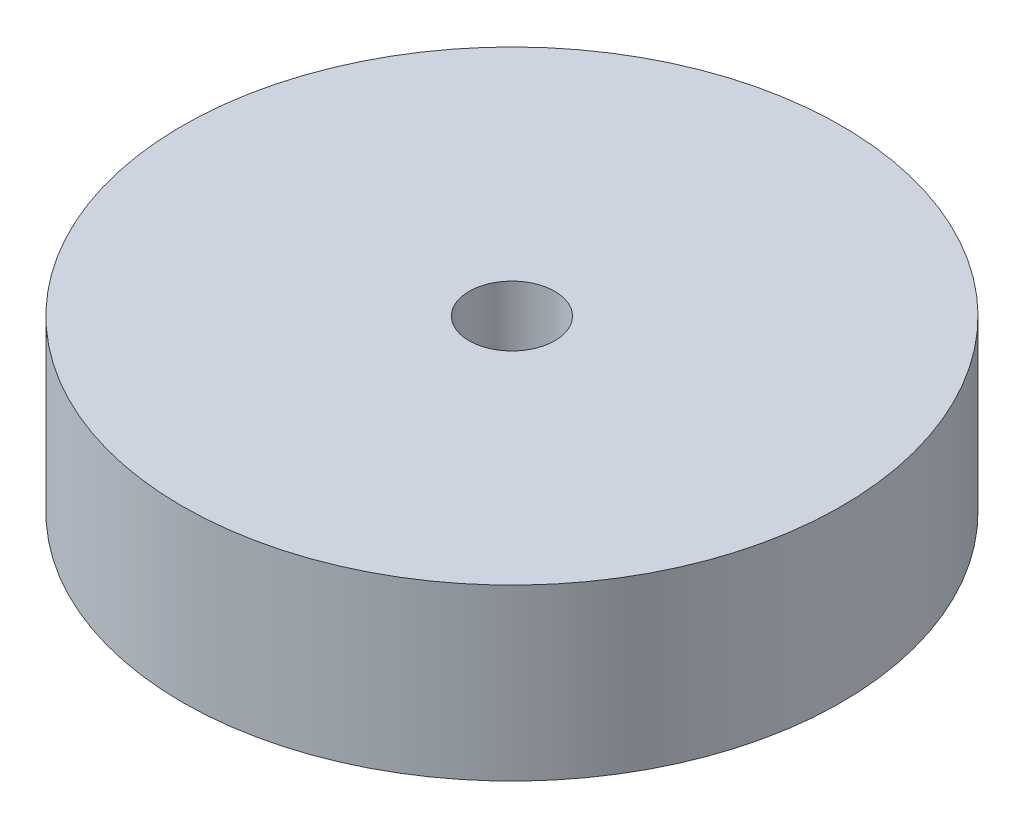
ISO-10303-21;
HEADER;
FILE_DESCRIPTION(('STEP AP214'),'2;1');
FILE_NAME('part.step','',(''),(''),'','','');
FILE_SCHEMA(('AUTOMOTIVE_DESIGN { 1 0 10303 214 1 1 1 1 }'));
ENDSEC;
DATA;
#1=APPLICATION_CONTEXT('core data for automotive mechanical design processes');
#2=APPLICATION_PROTOCOL_DEFINITION('international standard','automotive_design',2000,#1);
#3=PRODUCT_CONTEXT('',#1,'mechanical');
#4=PRODUCT('Part','Part','',(#3));
#5=PRODUCT_RELATED_PRODUCT_CATEGORY('part','',(#4));
#6=PRODUCT_DEFINITION_FORMATION('','',#4);
#7=PRODUCT_DEFINITION_CONTEXT('part definition',#1,'design');
#8=PRODUCT_DEFINITION('design','',#6,#7);
#9=PRODUCT_DEFINITION_SHAPE('','',#8);
#10=(LENGTH_UNIT() NAMED_UNIT(*) SI_UNIT(.MILLI.,.METRE.));
#11=(NAMED_UNIT(*) PLANE_ANGLE_UNIT() SI_UNIT($,.RADIAN.));
#12=(NAMED_UNIT(*) SI_UNIT($,.STERADIAN.) SOLID_ANGLE_UNIT());
#13=UNCERTAINTY_MEASURE_WITH_UNIT(LENGTH_MEASURE(1.E-05),#10,'distance_accuracy_value','');
#14=(GEOMETRIC_REPRESENTATION_CONTEXT(3) GLOBAL_UNCERTAINTY_ASSIGNED_CONTEXT((#13)) GLOBAL_UNIT_ASSIGNED_CONTEXT((#10,
#11,#12)) REPRESENTATION_CONTEXT('',''));
#15=CARTESIAN_POINT('',(0.,0.,0.));
#16=DIRECTION('',(0.,0.,1.));
#17=DIRECTION('',(1.,0.,0.));
#18=AXIS2_PLACEMENT_3D('',#15,#16,#17);
#19=CARTESIAN_POINT('',(0.,103.,0.));
#20=DIRECTION('',(0.,1.,0.));
#21=DIRECTION('',(0.,0.,1.));
#22=AXIS2_PLACEMENT_3D('',#19,#20,#21);
#23=PLANE('',#22);
#24=CARTESIAN_POINT('',(0.,103.,0.));
#25=DIRECTION('',(0.,1.,0.));
#26=DIRECTION('',(0.,0.,1.));
#27=AXIS2_PLACEMENT_3D('',#24,#25,#26);
#28=CIRCLE('',#27,200.);
#29=CARTESIAN_POINT('',(0.,103.,200.));
#30=VERTEX_POINT('',#29);
#31=EDGE_CURVE('E10',#30,#30,#28,.T.);
#32=ORIENTED_EDGE('',*,*,#31,.T.);
#33=EDGE_LOOP('',(#32));
#34=FACE_BOUND('',#33,.T.);
#35=CARTESIAN_POINT('',(0.,103.,0.));
#36=DIRECTION('',(0.,1.,0.));
#37=DIRECTION('',(0.,0.,1.));
#38=AXIS2_PLACEMENT_3D('',#35,#36,#37);
#39=CIRCLE('',#38,26.);
#40=CARTESIAN_POINT('',(0.,103.,26.));
#41=VERTEX_POINT('',#40);
#42=EDGE_CURVE('E41',#41,#41,#39,.T.);
#43=ORIENTED_EDGE('',*,*,#42,.F.);
#44=EDGE_LOOP('',(#43));
#45=FACE_BOUND('',#44,.T.);
#46=ADVANCED_FACE('F30',(#34,#45),#23,.T.);
#47=CARTESIAN_POINT('',(0.,0.,0.));
#48=DIRECTION('',(0.,1.,0.));
#49=DIRECTION('',(0.,0.,1.));
#50=AXIS2_PLACEMENT_3D('',#47,#48,#49);
#51=PLANE('',#50);
#52=CARTESIAN_POINT('',(0.,0.,0.));
#53=DIRECTION('',(0.,1.,0.));
#54=DIRECTION('',(0.,0.,1.));
#55=AXIS2_PLACEMENT_3D('',#52,#53,#54);
#56=CIRCLE('',#55,200.);
#57=CARTESIAN_POINT('',(0.,0.,200.));
#58=VERTEX_POINT('',#57);
#59=EDGE_CURVE('E34',#58,#58,#56,.T.);
#60=ORIENTED_EDGE('',*,*,#59,.F.);
#61=EDGE_LOOP('',(#60));
#62=FACE_BOUND('',#61,.T.);
#63=CARTESIAN_POINT('',(0.,0.,0.));
#64=DIRECTION('',(0.,1.,0.));
#65=DIRECTION('',(0.,0.,1.));
#66=AXIS2_PLACEMENT_3D('',#63,#64,#65);
#67=CIRCLE('',#66,26.);
#68=CARTESIAN_POINT('',(0.,0.,26.));
#69=VERTEX_POINT('',#68);
#70=EDGE_CURVE('E43',#69,#69,#67,.T.);
#71=ORIENTED_EDGE('',*,*,#70,.T.);
#72=EDGE_LOOP('',(#71));
#73=FACE_BOUND('',#72,.T.);
#74=ADVANCED_FACE('F53',(#62,#73),#51,.F.);
#75=CARTESIAN_POINT('',(0.,103.,0.));
#76=DIRECTION('',(0.,-1.,0.));
#77=DIRECTION('',(0.,0.,-1.));
#78=AXIS2_PLACEMENT_3D('',#75,#76,#77);
#79=CYLINDRICAL_SURFACE('',#78,200.);
#80=ORIENTED_EDGE('',*,*,#31,.F.);
#81=EDGE_LOOP('',(#80));
#82=FACE_BOUND('',#81,.T.);
#83=ORIENTED_EDGE('',*,*,#59,.T.);
#84=EDGE_LOOP('',(#83));
#85=FACE_BOUND('',#84,.T.);
#86=ADVANCED_FACE('F32',(#82,#85),#79,.T.);
#87=CARTESIAN_POINT('',(0.,103.,0.));
#88=DIRECTION('',(0.,-1.,0.));
#89=DIRECTION('',(0.,0.,-1.));
#90=AXIS2_PLACEMENT_3D('',#87,#88,#89);
#91=CYLINDRICAL_SURFACE('',#90,26.);
#92=ORIENTED_EDGE('',*,*,#42,.T.);
#93=EDGE_LOOP('',(#92));
#94=FACE_BOUND('',#93,.T.);
#95=ORIENTED_EDGE('',*,*,#70,.F.);
#96=EDGE_LOOP('',(#95));
#97=FACE_BOUND('',#96,.T.);
#98=ADVANCED_FACE('F49',(#94,#97),#91,.F.);
#99=CLOSED_SHELL('',(#46,#74,#86,#98));
#100=MANIFOLD_SOLID_BREP('B2',#99);
#101=ADVANCED_BREP_SHAPE_REPRESENTATION('',(#18,#100),#14);
#102=SHAPE_DEFINITION_REPRESENTATION(#9,#101);
ENDSEC;
END-ISO-10303-21;
